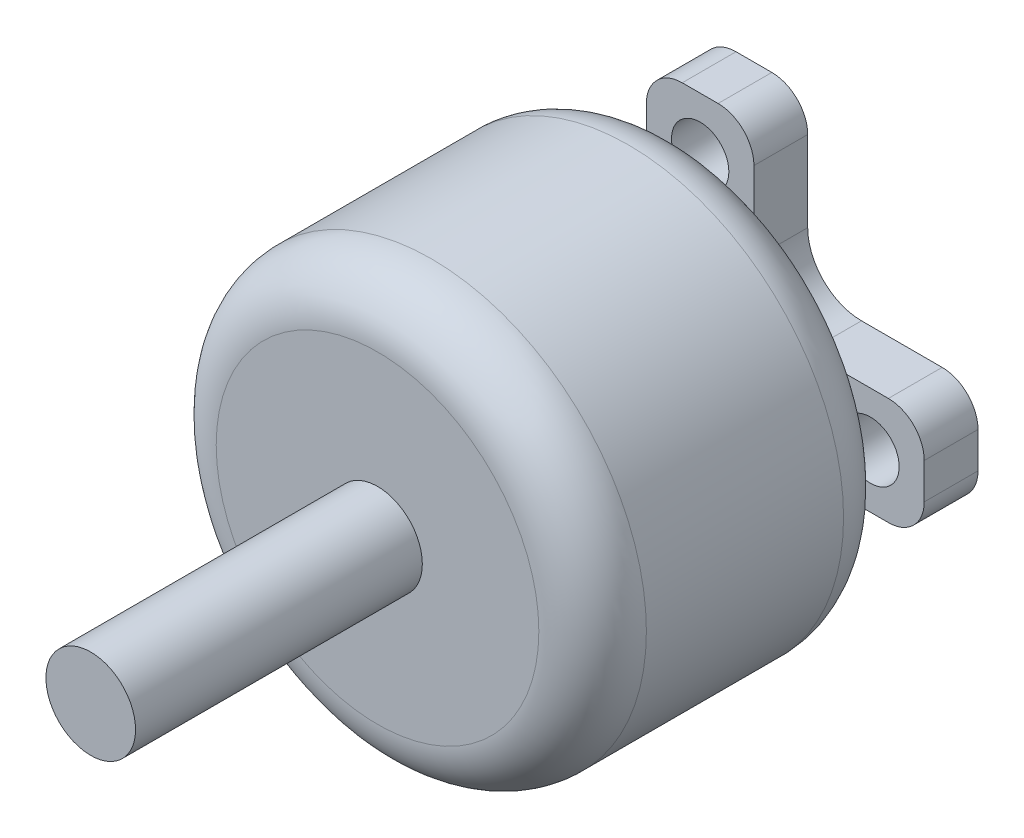
ISO-10303-21;
HEADER;
FILE_DESCRIPTION(('STEP AP214'),'2;1');
FILE_NAME('part.step','',(''),(''),'','','');
FILE_SCHEMA(('AUTOMOTIVE_DESIGN { 1 0 10303 214 1 1 1 1 }'));
ENDSEC;
DATA;
#1=APPLICATION_CONTEXT('core data for automotive mechanical design processes');
#2=APPLICATION_PROTOCOL_DEFINITION('international standard','automotive_design',2000,#1);
#3=PRODUCT_CONTEXT('',#1,'mechanical');
#4=PRODUCT('Part','Part','',(#3));
#5=PRODUCT_RELATED_PRODUCT_CATEGORY('part','',(#4));
#6=PRODUCT_DEFINITION_FORMATION('','',#4);
#7=PRODUCT_DEFINITION_CONTEXT('part definition',#1,'design');
#8=PRODUCT_DEFINITION('design','',#6,#7);
#9=PRODUCT_DEFINITION_SHAPE('','',#8);
#10=(LENGTH_UNIT() NAMED_UNIT(*) SI_UNIT(.MILLI.,.METRE.));
#11=(NAMED_UNIT(*) PLANE_ANGLE_UNIT() SI_UNIT($,.RADIAN.));
#12=(NAMED_UNIT(*) SI_UNIT($,.STERADIAN.) SOLID_ANGLE_UNIT());
#13=UNCERTAINTY_MEASURE_WITH_UNIT(LENGTH_MEASURE(1.E-05),#10,'distance_accuracy_value','');
#14=(GEOMETRIC_REPRESENTATION_CONTEXT(3) GLOBAL_UNCERTAINTY_ASSIGNED_CONTEXT((#13)) GLOBAL_UNIT_ASSIGNED_CONTEXT((#10,
#11,#12)) REPRESENTATION_CONTEXT('',''));
#15=CARTESIAN_POINT('',(0.,0.,0.));
#16=DIRECTION('',(0.,0.,1.));
#17=DIRECTION('',(1.,0.,0.));
#18=AXIS2_PLACEMENT_3D('',#15,#16,#17);
#19=CARTESIAN_POINT('',(-83.7817459305203,-83.7817459305202,3.));
#20=DIRECTION('',(0.,0.,1.));
#21=DIRECTION('',(1.,0.,0.));
#22=AXIS2_PLACEMENT_3D('',#19,#20,#21);
#23=PLANE('',#22);
#24=CARTESIAN_POINT('',(-77.7817459305204,-77.7817459305201,3.));
#25=DIRECTION('',(0.,0.,1.));
#26=DIRECTION('',(1.,0.,0.));
#27=AXIS2_PLACEMENT_3D('',#24,#25,#26);
#28=CIRCLE('',#27,2.85201126427934);
#29=CARTESIAN_POINT('',(-74.9297346662411,-77.7817459305201,3.));
#30=VERTEX_POINT('',#29);
#31=EDGE_CURVE('E373',#30,#30,#28,.T.);
#32=ORIENTED_EDGE('',*,*,#31,.F.);
#33=EDGE_LOOP('',(#32));
#34=FACE_BOUND('',#33,.T.);
#35=CARTESIAN_POINT('',(-77.7817459305203,-87.2817459305201,3.));
#36=DIRECTION('',(0.,0.,1.));
#37=DIRECTION('',(1.,0.,0.));
#38=AXIS2_PLACEMENT_3D('',#35,#36,#37);
#39=CIRCLE('',#38,1.59999999999992);
#40=CARTESIAN_POINT('',(-76.1817459305204,-87.2817459305201,3.));
#41=VERTEX_POINT('',#40);
#42=EDGE_CURVE('E382',#41,#41,#39,.T.);
#43=ORIENTED_EDGE('',*,*,#42,.F.);
#44=EDGE_LOOP('',(#43));
#45=FACE_BOUND('',#44,.T.);
#46=CARTESIAN_POINT('',(-77.7817459305205,-68.2817459305201,3.));
#47=DIRECTION('',(0.,0.,1.));
#48=DIRECTION('',(1.,0.,0.));
#49=AXIS2_PLACEMENT_3D('',#46,#47,#48);
#50=CIRCLE('',#49,1.60000000000002);
#51=CARTESIAN_POINT('',(-76.1817459305204,-68.2817459305201,3.));
#52=VERTEX_POINT('',#51);
#53=EDGE_CURVE('E233',#52,#52,#50,.T.);
#54=ORIENTED_EDGE('',*,*,#53,.F.);
#55=EDGE_LOOP('',(#54));
#56=FACE_BOUND('',#55,.T.);
#57=CARTESIAN_POINT('',(-83.7817459305203,-83.7817459305202,3.));
#58=DIRECTION('',(0.,0.,-1.));
#59=DIRECTION('',(1.,0.,0.));
#60=AXIS2_PLACEMENT_3D('',#57,#58,#59);
#61=CIRCLE('',#60,3.);
#62=CARTESIAN_POINT('',(-83.7817459305203,-80.7817459305202,3.));
#63=VERTEX_POINT('',#62);
#64=CARTESIAN_POINT('',(-80.7817459305203,-83.7817459305202,3.));
#65=VERTEX_POINT('',#64);
#66=EDGE_CURVE('E276',#63,#65,#61,.T.);
#67=ORIENTED_EDGE('',*,*,#66,.T.);
#68=DIRECTION('',(0.,-1.,0.));
#69=VECTOR('',#68,1.);
#70=CARTESIAN_POINT('',(-80.7817459305203,-83.7817459305202,3.));
#71=LINE('',#70,#69);
#72=CARTESIAN_POINT('',(-80.7817459305203,-88.2817459305201,3.));
#73=VERTEX_POINT('',#72);
#74=EDGE_CURVE('E144',#65,#73,#71,.T.);
#75=ORIENTED_EDGE('',*,*,#74,.T.);
#76=CARTESIAN_POINT('',(-78.7817459305203,-88.2817459305201,3.));
#77=DIRECTION('',(0.,0.,1.));
#78=DIRECTION('',(1.,0.,0.));
#79=AXIS2_PLACEMENT_3D('',#76,#77,#78);
#80=CIRCLE('',#79,2.);
#81=CARTESIAN_POINT('',(-78.7817459305203,-90.2817459305201,3.));
#82=VERTEX_POINT('',#81);
#83=EDGE_CURVE('E400',#73,#82,#80,.T.);
#84=ORIENTED_EDGE('',*,*,#83,.T.);
#85=DIRECTION('',(1.,0.,0.));
#86=VECTOR('',#85,1.);
#87=CARTESIAN_POINT('',(-78.7817459305203,-90.2817459305201,3.));
#88=LINE('',#87,#86);
#89=CARTESIAN_POINT('',(-76.7817459305203,-90.2817459305201,3.));
#90=VERTEX_POINT('',#89);
#91=EDGE_CURVE('E402',#82,#90,#88,.T.);
#92=ORIENTED_EDGE('',*,*,#91,.T.);
#93=CARTESIAN_POINT('',(-76.7817459305203,-88.2817459305201,3.));
#94=DIRECTION('',(0.,0.,1.));
#95=DIRECTION('',(1.,0.,0.));
#96=AXIS2_PLACEMENT_3D('',#93,#94,#95);
#97=CIRCLE('',#96,2.);
#98=CARTESIAN_POINT('',(-74.7817459305203,-88.2817459305201,3.));
#99=VERTEX_POINT('',#98);
#100=EDGE_CURVE('E404',#90,#99,#97,.T.);
#101=ORIENTED_EDGE('',*,*,#100,.T.);
#102=DIRECTION('',(0.,1.,0.));
#103=VECTOR('',#102,1.);
#104=CARTESIAN_POINT('',(-74.7817459305203,-83.7817459305202,3.));
#105=LINE('',#104,#103);
#106=CARTESIAN_POINT('',(-74.7817459305203,-83.7817459305202,3.));
#107=VERTEX_POINT('',#106);
#108=EDGE_CURVE('E406',#99,#107,#105,.T.);
#109=ORIENTED_EDGE('',*,*,#108,.T.);
#110=CARTESIAN_POINT('',(-71.7817459305203,-83.7817459305202,3.));
#111=DIRECTION('',(0.,0.,-1.));
#112=DIRECTION('',(-1.,0.,0.));
#113=AXIS2_PLACEMENT_3D('',#110,#111,#112);
#114=CIRCLE('',#113,3.);
#115=CARTESIAN_POINT('',(-71.7817459305203,-80.7817459305202,3.));
#116=VERTEX_POINT('',#115);
#117=EDGE_CURVE('E408',#107,#116,#114,.T.);
#118=ORIENTED_EDGE('',*,*,#117,.T.);
#119=DIRECTION('',(1.,0.,0.));
#120=VECTOR('',#119,1.);
#121=CARTESIAN_POINT('',(-71.7817459305203,-80.7817459305202,3.));
#122=LINE('',#121,#120);
#123=CARTESIAN_POINT('',(-67.2817459305204,-80.7817459305202,3.));
#124=VERTEX_POINT('',#123);
#125=EDGE_CURVE('E410',#116,#124,#122,.T.);
#126=ORIENTED_EDGE('',*,*,#125,.T.);
#127=CARTESIAN_POINT('',(-67.2817459305204,-78.7817459305202,3.));
#128=DIRECTION('',(0.,0.,1.));
#129=DIRECTION('',(1.,0.,0.));
#130=AXIS2_PLACEMENT_3D('',#127,#128,#129);
#131=CIRCLE('',#130,2.);
#132=CARTESIAN_POINT('',(-65.2817459305204,-78.7817459305202,3.));
#133=VERTEX_POINT('',#132);
#134=EDGE_CURVE('E412',#124,#133,#131,.T.);
#135=ORIENTED_EDGE('',*,*,#134,.T.);
#136=DIRECTION('',(0.,1.,0.));
#137=VECTOR('',#136,1.);
#138=CARTESIAN_POINT('',(-65.2817459305204,-76.7817459305202,3.));
#139=LINE('',#138,#137);
#140=CARTESIAN_POINT('',(-65.2817459305204,-76.7817459305202,3.));
#141=VERTEX_POINT('',#140);
#142=EDGE_CURVE('E414',#133,#141,#139,.T.);
#143=ORIENTED_EDGE('',*,*,#142,.T.);
#144=CARTESIAN_POINT('',(-67.2817459305204,-76.7817459305202,3.));
#145=DIRECTION('',(0.,0.,1.));
#146=DIRECTION('',(-1.,0.,0.));
#147=AXIS2_PLACEMENT_3D('',#144,#145,#146);
#148=CIRCLE('',#147,2.);
#149=CARTESIAN_POINT('',(-67.2817459305204,-74.7817459305202,3.));
#150=VERTEX_POINT('',#149);
#151=EDGE_CURVE('E416',#141,#150,#148,.T.);
#152=ORIENTED_EDGE('',*,*,#151,.T.);
#153=DIRECTION('',(-1.,0.,0.));
#154=VECTOR('',#153,1.);
#155=CARTESIAN_POINT('',(-71.7817459305203,-74.7817459305202,3.));
#156=LINE('',#155,#154);
#157=CARTESIAN_POINT('',(-71.7817459305203,-74.7817459305202,3.));
#158=VERTEX_POINT('',#157);
#159=EDGE_CURVE('E418',#150,#158,#156,.T.);
#160=ORIENTED_EDGE('',*,*,#159,.T.);
#161=CARTESIAN_POINT('',(-71.7817459305203,-71.7817459305202,3.));
#162=DIRECTION('',(0.,0.,-1.));
#163=DIRECTION('',(-1.,0.,0.));
#164=AXIS2_PLACEMENT_3D('',#161,#162,#163);
#165=CIRCLE('',#164,3.);
#166=CARTESIAN_POINT('',(-74.7817459305203,-71.7817459305202,3.));
#167=VERTEX_POINT('',#166);
#168=EDGE_CURVE('E420',#158,#167,#165,.T.);
#169=ORIENTED_EDGE('',*,*,#168,.T.);
#170=DIRECTION('',(0.,1.,0.));
#171=VECTOR('',#170,1.);
#172=CARTESIAN_POINT('',(-74.7817459305203,-67.2817459305201,3.));
#173=LINE('',#172,#171);
#174=CARTESIAN_POINT('',(-74.7817459305203,-67.2817459305201,3.));
#175=VERTEX_POINT('',#174);
#176=EDGE_CURVE('E422',#167,#175,#173,.T.);
#177=ORIENTED_EDGE('',*,*,#176,.T.);
#178=CARTESIAN_POINT('',(-76.7817459305203,-67.2817459305201,3.));
#179=DIRECTION('',(0.,0.,1.));
#180=DIRECTION('',(-1.,0.,0.));
#181=AXIS2_PLACEMENT_3D('',#178,#179,#180);
#182=CIRCLE('',#181,2.);
#183=CARTESIAN_POINT('',(-76.7817459305203,-65.2817459305201,3.));
#184=VERTEX_POINT('',#183);
#185=EDGE_CURVE('E424',#175,#184,#182,.T.);
#186=ORIENTED_EDGE('',*,*,#185,.T.);
#187=DIRECTION('',(-1.,0.,0.));
#188=VECTOR('',#187,1.);
#189=CARTESIAN_POINT('',(-78.7817459305203,-65.2817459305201,3.));
#190=LINE('',#189,#188);
#191=CARTESIAN_POINT('',(-78.7817459305203,-65.2817459305201,3.));
#192=VERTEX_POINT('',#191);
#193=EDGE_CURVE('E426',#184,#192,#190,.T.);
#194=ORIENTED_EDGE('',*,*,#193,.T.);
#195=CARTESIAN_POINT('',(-78.7817459305203,-67.2817459305201,3.));
#196=DIRECTION('',(0.,0.,1.));
#197=DIRECTION('',(1.,0.,0.));
#198=AXIS2_PLACEMENT_3D('',#195,#196,#197);
#199=CIRCLE('',#198,2.);
#200=CARTESIAN_POINT('',(-80.7817459305203,-67.2817459305201,3.));
#201=VERTEX_POINT('',#200);
#202=EDGE_CURVE('E428',#192,#201,#199,.T.);
#203=ORIENTED_EDGE('',*,*,#202,.T.);
#204=DIRECTION('',(0.,-1.,0.));
#205=VECTOR('',#204,1.);
#206=CARTESIAN_POINT('',(-80.7817459305203,-67.2817459305201,3.));
#207=LINE('',#206,#205);
#208=CARTESIAN_POINT('',(-80.7817459305203,-71.7817459305202,3.));
#209=VERTEX_POINT('',#208);
#210=EDGE_CURVE('E430',#201,#209,#207,.T.);
#211=ORIENTED_EDGE('',*,*,#210,.T.);
#212=CARTESIAN_POINT('',(-83.7817459305203,-71.7817459305202,3.));
#213=DIRECTION('',(0.,0.,-1.));
#214=DIRECTION('',(1.,0.,0.));
#215=AXIS2_PLACEMENT_3D('',#212,#213,#214);
#216=CIRCLE('',#215,3.);
#217=CARTESIAN_POINT('',(-83.7817459305203,-74.7817459305202,3.));
#218=VERTEX_POINT('',#217);
#219=EDGE_CURVE('E432',#209,#218,#216,.T.);
#220=ORIENTED_EDGE('',*,*,#219,.T.);
#221=DIRECTION('',(-1.,0.,0.));
#222=VECTOR('',#221,1.);
#223=CARTESIAN_POINT('',(-88.2817459305204,-74.7817459305202,3.));
#224=LINE('',#223,#222);
#225=CARTESIAN_POINT('',(-88.2817459305204,-74.7817459305202,3.));
#226=VERTEX_POINT('',#225);
#227=EDGE_CURVE('E434',#218,#226,#224,.T.);
#228=ORIENTED_EDGE('',*,*,#227,.T.);
#229=CARTESIAN_POINT('',(-88.2817459305204,-76.7817459305202,3.));
#230=DIRECTION('',(0.,0.,1.));
#231=DIRECTION('',(1.,0.,0.));
#232=AXIS2_PLACEMENT_3D('',#229,#230,#231);
#233=CIRCLE('',#232,2.);
#234=CARTESIAN_POINT('',(-90.2817459305204,-76.7817459305202,3.));
#235=VERTEX_POINT('',#234);
#236=EDGE_CURVE('E211',#226,#235,#233,.T.);
#237=ORIENTED_EDGE('',*,*,#236,.T.);
#238=DIRECTION('',(0.,-1.,0.));
#239=VECTOR('',#238,1.);
#240=CARTESIAN_POINT('',(-90.2817459305204,-76.7817459305202,3.));
#241=LINE('',#240,#239);
#242=CARTESIAN_POINT('',(-90.2817459305204,-78.7817459305202,3.));
#243=VERTEX_POINT('',#242);
#244=EDGE_CURVE('E205',#235,#243,#241,.T.);
#245=ORIENTED_EDGE('',*,*,#244,.T.);
#246=CARTESIAN_POINT('',(-88.2817459305204,-78.7817459305202,3.));
#247=DIRECTION('',(0.,0.,1.));
#248=DIRECTION('',(1.,0.,0.));
#249=AXIS2_PLACEMENT_3D('',#246,#247,#248);
#250=CIRCLE('',#249,2.);
#251=CARTESIAN_POINT('',(-88.2817459305204,-80.7817459305202,3.));
#252=VERTEX_POINT('',#251);
#253=EDGE_CURVE('E209',#243,#252,#250,.T.);
#254=ORIENTED_EDGE('',*,*,#253,.T.);
#255=DIRECTION('',(1.,0.,0.));
#256=VECTOR('',#255,1.);
#257=CARTESIAN_POINT('',(-88.2817459305204,-80.7817459305202,3.));
#258=LINE('',#257,#256);
#259=EDGE_CURVE('E52',#252,#63,#258,.T.);
#260=ORIENTED_EDGE('',*,*,#259,.T.);
#261=EDGE_LOOP('',(#67,#75,#84,#92,#101,#109,#118,#126,#135,#143,#152,#160,#169,#177,#186,#194,
#203,#211,#220,#228,#237,#245,#254,#260));
#262=FACE_BOUND('',#261,.T.);
#263=CARTESIAN_POINT('',(-68.2817459305204,-77.7817459305201,3.));
#264=DIRECTION('',(0.,0.,1.));
#265=DIRECTION('',(1.,0.,0.));
#266=AXIS2_PLACEMENT_3D('',#263,#264,#265);
#267=CIRCLE('',#266,1.59999999999995);
#268=CARTESIAN_POINT('',(-66.6817459305205,-77.7817459305201,3.));
#269=VERTEX_POINT('',#268);
#270=EDGE_CURVE('E388',#269,#269,#267,.T.);
#271=ORIENTED_EDGE('',*,*,#270,.F.);
#272=EDGE_LOOP('',(#271));
#273=FACE_BOUND('',#272,.T.);
#274=CARTESIAN_POINT('',(-87.2817459305204,-77.7817459305202,3.));
#275=DIRECTION('',(0.,0.,1.));
#276=DIRECTION('',(1.,0.,0.));
#277=AXIS2_PLACEMENT_3D('',#274,#275,#276);
#278=CIRCLE('',#277,1.60000000000001);
#279=CARTESIAN_POINT('',(-85.6817459305204,-77.7817459305202,3.));
#280=VERTEX_POINT('',#279);
#281=EDGE_CURVE('E376',#280,#280,#278,.T.);
#282=ORIENTED_EDGE('',*,*,#281,.F.);
#283=EDGE_LOOP('',(#282));
#284=FACE_BOUND('',#283,.T.);
#285=ADVANCED_FACE('F35',(#34,#45,#56,#262,#273,#284),#23,.T.);
#286=CARTESIAN_POINT('',(-83.7817459305203,-83.7817459305202,0.));
#287=DIRECTION('',(0.,0.,1.));
#288=DIRECTION('',(1.,0.,0.));
#289=AXIS2_PLACEMENT_3D('',#286,#287,#288);
#290=PLANE('',#289);
#291=CARTESIAN_POINT('',(-83.7817459305203,-83.7817459305202,0.));
#292=DIRECTION('',(0.,0.,-1.));
#293=DIRECTION('',(1.,0.,0.));
#294=AXIS2_PLACEMENT_3D('',#291,#292,#293);
#295=CIRCLE('',#294,3.);
#296=CARTESIAN_POINT('',(-83.7817459305203,-80.7817459305202,0.));
#297=VERTEX_POINT('',#296);
#298=CARTESIAN_POINT('',(-80.7817459305203,-83.7817459305202,0.));
#299=VERTEX_POINT('',#298);
#300=EDGE_CURVE('E229',#297,#299,#295,.T.);
#301=ORIENTED_EDGE('',*,*,#300,.F.);
#302=DIRECTION('',(1.,0.,0.));
#303=VECTOR('',#302,1.);
#304=CARTESIAN_POINT('',(-88.2817459305204,-80.7817459305202,0.));
#305=LINE('',#304,#303);
#306=CARTESIAN_POINT('',(-88.2817459305204,-80.7817459305202,0.));
#307=VERTEX_POINT('',#306);
#308=EDGE_CURVE('E135',#307,#297,#305,.T.);
#309=ORIENTED_EDGE('',*,*,#308,.F.);
#310=CARTESIAN_POINT('',(-88.2817459305204,-78.7817459305202,0.));
#311=DIRECTION('',(0.,0.,1.));
#312=DIRECTION('',(1.,0.,0.));
#313=AXIS2_PLACEMENT_3D('',#310,#311,#312);
#314=CIRCLE('',#313,2.);
#315=CARTESIAN_POINT('',(-90.2817459305204,-78.7817459305202,0.));
#316=VERTEX_POINT('',#315);
#317=EDGE_CURVE('E129',#316,#307,#314,.T.);
#318=ORIENTED_EDGE('',*,*,#317,.F.);
#319=DIRECTION('',(0.,-1.,0.));
#320=VECTOR('',#319,1.);
#321=CARTESIAN_POINT('',(-90.2817459305204,-76.7817459305202,0.));
#322=LINE('',#321,#320);
#323=CARTESIAN_POINT('',(-90.2817459305204,-76.7817459305202,0.));
#324=VERTEX_POINT('',#323);
#325=EDGE_CURVE('E219',#324,#316,#322,.T.);
#326=ORIENTED_EDGE('',*,*,#325,.F.);
#327=CARTESIAN_POINT('',(-88.2817459305204,-76.7817459305202,0.));
#328=DIRECTION('',(0.,0.,1.));
#329=DIRECTION('',(1.,0.,0.));
#330=AXIS2_PLACEMENT_3D('',#327,#328,#329);
#331=CIRCLE('',#330,2.);
#332=CARTESIAN_POINT('',(-88.2817459305204,-74.7817459305202,0.));
#333=VERTEX_POINT('',#332);
#334=EDGE_CURVE('E271',#333,#324,#331,.T.);
#335=ORIENTED_EDGE('',*,*,#334,.F.);
#336=DIRECTION('',(-1.,0.,0.));
#337=VECTOR('',#336,1.);
#338=CARTESIAN_POINT('',(-88.2817459305204,-74.7817459305202,0.));
#339=LINE('',#338,#337);
#340=CARTESIAN_POINT('',(-83.7817459305203,-74.7817459305202,0.));
#341=VERTEX_POINT('',#340);
#342=EDGE_CURVE('E269',#341,#333,#339,.T.);
#343=ORIENTED_EDGE('',*,*,#342,.F.);
#344=CARTESIAN_POINT('',(-83.7817459305203,-71.7817459305202,0.));
#345=DIRECTION('',(0.,0.,-1.));
#346=DIRECTION('',(1.,0.,0.));
#347=AXIS2_PLACEMENT_3D('',#344,#345,#346);
#348=CIRCLE('',#347,3.);
#349=CARTESIAN_POINT('',(-80.7817459305203,-71.7817459305202,0.));
#350=VERTEX_POINT('',#349);
#351=EDGE_CURVE('E267',#350,#341,#348,.T.);
#352=ORIENTED_EDGE('',*,*,#351,.F.);
#353=DIRECTION('',(0.,-1.,0.));
#354=VECTOR('',#353,1.);
#355=CARTESIAN_POINT('',(-80.7817459305203,-67.2817459305201,0.));
#356=LINE('',#355,#354);
#357=CARTESIAN_POINT('',(-80.7817459305203,-67.2817459305201,0.));
#358=VERTEX_POINT('',#357);
#359=EDGE_CURVE('E265',#358,#350,#356,.T.);
#360=ORIENTED_EDGE('',*,*,#359,.F.);
#361=CARTESIAN_POINT('',(-78.7817459305203,-67.2817459305201,0.));
#362=DIRECTION('',(0.,0.,1.));
#363=DIRECTION('',(1.,0.,0.));
#364=AXIS2_PLACEMENT_3D('',#361,#362,#363);
#365=CIRCLE('',#364,2.);
#366=CARTESIAN_POINT('',(-78.7817459305203,-65.2817459305201,0.));
#367=VERTEX_POINT('',#366);
#368=EDGE_CURVE('E263',#367,#358,#365,.T.);
#369=ORIENTED_EDGE('',*,*,#368,.F.);
#370=DIRECTION('',(-1.,0.,0.));
#371=VECTOR('',#370,1.);
#372=CARTESIAN_POINT('',(-78.7817459305203,-65.2817459305201,0.));
#373=LINE('',#372,#371);
#374=CARTESIAN_POINT('',(-76.7817459305203,-65.2817459305201,0.));
#375=VERTEX_POINT('',#374);
#376=EDGE_CURVE('E261',#375,#367,#373,.T.);
#377=ORIENTED_EDGE('',*,*,#376,.F.);
#378=CARTESIAN_POINT('',(-76.7817459305203,-67.2817459305201,0.));
#379=DIRECTION('',(0.,0.,1.));
#380=DIRECTION('',(-1.,0.,0.));
#381=AXIS2_PLACEMENT_3D('',#378,#379,#380);
#382=CIRCLE('',#381,2.);
#383=CARTESIAN_POINT('',(-74.7817459305203,-67.2817459305201,0.));
#384=VERTEX_POINT('',#383);
#385=EDGE_CURVE('E259',#384,#375,#382,.T.);
#386=ORIENTED_EDGE('',*,*,#385,.F.);
#387=DIRECTION('',(0.,1.,0.));
#388=VECTOR('',#387,1.);
#389=CARTESIAN_POINT('',(-74.7817459305203,-67.2817459305201,0.));
#390=LINE('',#389,#388);
#391=CARTESIAN_POINT('',(-74.7817459305203,-71.7817459305202,0.));
#392=VERTEX_POINT('',#391);
#393=EDGE_CURVE('E257',#392,#384,#390,.T.);
#394=ORIENTED_EDGE('',*,*,#393,.F.);
#395=CARTESIAN_POINT('',(-71.7817459305203,-71.7817459305202,0.));
#396=DIRECTION('',(0.,0.,-1.));
#397=DIRECTION('',(-1.,0.,0.));
#398=AXIS2_PLACEMENT_3D('',#395,#396,#397);
#399=CIRCLE('',#398,3.);
#400=CARTESIAN_POINT('',(-71.7817459305203,-74.7817459305202,0.));
#401=VERTEX_POINT('',#400);
#402=EDGE_CURVE('E255',#401,#392,#399,.T.);
#403=ORIENTED_EDGE('',*,*,#402,.F.);
#404=DIRECTION('',(-1.,0.,0.));
#405=VECTOR('',#404,1.);
#406=CARTESIAN_POINT('',(-71.7817459305203,-74.7817459305202,0.));
#407=LINE('',#406,#405);
#408=CARTESIAN_POINT('',(-67.2817459305204,-74.7817459305202,0.));
#409=VERTEX_POINT('',#408);
#410=EDGE_CURVE('E253',#409,#401,#407,.T.);
#411=ORIENTED_EDGE('',*,*,#410,.F.);
#412=CARTESIAN_POINT('',(-67.2817459305204,-76.7817459305202,0.));
#413=DIRECTION('',(0.,0.,1.));
#414=DIRECTION('',(-1.,0.,0.));
#415=AXIS2_PLACEMENT_3D('',#412,#413,#414);
#416=CIRCLE('',#415,2.);
#417=CARTESIAN_POINT('',(-65.2817459305204,-76.7817459305202,0.));
#418=VERTEX_POINT('',#417);
#419=EDGE_CURVE('E251',#418,#409,#416,.T.);
#420=ORIENTED_EDGE('',*,*,#419,.F.);
#421=DIRECTION('',(0.,1.,0.));
#422=VECTOR('',#421,1.);
#423=CARTESIAN_POINT('',(-65.2817459305204,-76.7817459305202,0.));
#424=LINE('',#423,#422);
#425=CARTESIAN_POINT('',(-65.2817459305204,-78.7817459305202,0.));
#426=VERTEX_POINT('',#425);
#427=EDGE_CURVE('E249',#426,#418,#424,.T.);
#428=ORIENTED_EDGE('',*,*,#427,.F.);
#429=CARTESIAN_POINT('',(-67.2817459305204,-78.7817459305202,0.));
#430=DIRECTION('',(0.,0.,1.));
#431=DIRECTION('',(1.,0.,0.));
#432=AXIS2_PLACEMENT_3D('',#429,#430,#431);
#433=CIRCLE('',#432,2.);
#434=CARTESIAN_POINT('',(-67.2817459305204,-80.7817459305202,0.));
#435=VERTEX_POINT('',#434);
#436=EDGE_CURVE('E247',#435,#426,#433,.T.);
#437=ORIENTED_EDGE('',*,*,#436,.F.);
#438=DIRECTION('',(1.,0.,0.));
#439=VECTOR('',#438,1.);
#440=CARTESIAN_POINT('',(-71.7817459305203,-80.7817459305202,0.));
#441=LINE('',#440,#439);
#442=CARTESIAN_POINT('',(-71.7817459305203,-80.7817459305202,0.));
#443=VERTEX_POINT('',#442);
#444=EDGE_CURVE('E245',#443,#435,#441,.T.);
#445=ORIENTED_EDGE('',*,*,#444,.F.);
#446=CARTESIAN_POINT('',(-71.7817459305203,-83.7817459305202,0.));
#447=DIRECTION('',(0.,0.,-1.));
#448=DIRECTION('',(-1.,0.,0.));
#449=AXIS2_PLACEMENT_3D('',#446,#447,#448);
#450=CIRCLE('',#449,3.);
#451=CARTESIAN_POINT('',(-74.7817459305203,-83.7817459305202,0.));
#452=VERTEX_POINT('',#451);
#453=EDGE_CURVE('E243',#452,#443,#450,.T.);
#454=ORIENTED_EDGE('',*,*,#453,.F.);
#455=DIRECTION('',(0.,1.,0.));
#456=VECTOR('',#455,1.);
#457=CARTESIAN_POINT('',(-74.7817459305203,-83.7817459305202,0.));
#458=LINE('',#457,#456);
#459=CARTESIAN_POINT('',(-74.7817459305203,-88.2817459305201,0.));
#460=VERTEX_POINT('',#459);
#461=EDGE_CURVE('E241',#460,#452,#458,.T.);
#462=ORIENTED_EDGE('',*,*,#461,.F.);
#463=CARTESIAN_POINT('',(-76.7817459305203,-88.2817459305201,0.));
#464=DIRECTION('',(0.,0.,1.));
#465=DIRECTION('',(1.,0.,0.));
#466=AXIS2_PLACEMENT_3D('',#463,#464,#465);
#467=CIRCLE('',#466,2.);
#468=CARTESIAN_POINT('',(-76.7817459305203,-90.2817459305201,0.));
#469=VERTEX_POINT('',#468);
#470=EDGE_CURVE('E239',#469,#460,#467,.T.);
#471=ORIENTED_EDGE('',*,*,#470,.F.);
#472=DIRECTION('',(1.,0.,0.));
#473=VECTOR('',#472,1.);
#474=CARTESIAN_POINT('',(-78.7817459305203,-90.2817459305201,0.));
#475=LINE('',#474,#473);
#476=CARTESIAN_POINT('',(-78.7817459305203,-90.2817459305201,0.));
#477=VERTEX_POINT('',#476);
#478=EDGE_CURVE('E237',#477,#469,#475,.T.);
#479=ORIENTED_EDGE('',*,*,#478,.F.);
#480=CARTESIAN_POINT('',(-78.7817459305203,-88.2817459305201,0.));
#481=DIRECTION('',(0.,0.,1.));
#482=DIRECTION('',(1.,0.,0.));
#483=AXIS2_PLACEMENT_3D('',#480,#481,#482);
#484=CIRCLE('',#483,2.);
#485=CARTESIAN_POINT('',(-80.7817459305203,-88.2817459305201,0.));
#486=VERTEX_POINT('',#485);
#487=EDGE_CURVE('E235',#486,#477,#484,.T.);
#488=ORIENTED_EDGE('',*,*,#487,.F.);
#489=DIRECTION('',(0.,-1.,0.));
#490=VECTOR('',#489,1.);
#491=CARTESIAN_POINT('',(-80.7817459305203,-83.7817459305202,0.));
#492=LINE('',#491,#490);
#493=EDGE_CURVE('E232',#299,#486,#492,.T.);
#494=ORIENTED_EDGE('',*,*,#493,.F.);
#495=EDGE_LOOP('',(#301,#309,#318,#326,#335,#343,#352,#360,#369,#377,#386,#394,#403,#411,#420,
#428,#437,#445,#454,#462,#471,#479,#488,#494));
#496=FACE_BOUND('',#495,.T.);
#497=CARTESIAN_POINT('',(-77.7817459305205,-68.2817459305201,0.));
#498=DIRECTION('',(0.,0.,1.));
#499=DIRECTION('',(1.,0.,0.));
#500=AXIS2_PLACEMENT_3D('',#497,#498,#499);
#501=CIRCLE('',#500,1.60000000000002);
#502=CARTESIAN_POINT('',(-76.1817459305204,-68.2817459305201,0.));
#503=VERTEX_POINT('',#502);
#504=EDGE_CURVE('E391',#503,#503,#501,.T.);
#505=ORIENTED_EDGE('',*,*,#504,.T.);
#506=EDGE_LOOP('',(#505));
#507=FACE_BOUND('',#506,.T.);
#508=CARTESIAN_POINT('',(-68.2817459305204,-77.7817459305201,0.));
#509=DIRECTION('',(0.,0.,1.));
#510=DIRECTION('',(1.,0.,0.));
#511=AXIS2_PLACEMENT_3D('',#508,#509,#510);
#512=CIRCLE('',#511,1.59999999999995);
#513=CARTESIAN_POINT('',(-66.6817459305205,-77.7817459305201,0.));
#514=VERTEX_POINT('',#513);
#515=EDGE_CURVE('E385',#514,#514,#512,.T.);
#516=ORIENTED_EDGE('',*,*,#515,.T.);
#517=EDGE_LOOP('',(#516));
#518=FACE_BOUND('',#517,.T.);
#519=CARTESIAN_POINT('',(-77.7817459305203,-87.2817459305201,0.));
#520=DIRECTION('',(0.,0.,1.));
#521=DIRECTION('',(1.,0.,0.));
#522=AXIS2_PLACEMENT_3D('',#519,#520,#521);
#523=CIRCLE('',#522,1.59999999999992);
#524=CARTESIAN_POINT('',(-76.1817459305204,-87.2817459305201,0.));
#525=VERTEX_POINT('',#524);
#526=EDGE_CURVE('E379',#525,#525,#523,.T.);
#527=ORIENTED_EDGE('',*,*,#526,.T.);
#528=EDGE_LOOP('',(#527));
#529=FACE_BOUND('',#528,.T.);
#530=CARTESIAN_POINT('',(-87.2817459305204,-77.7817459305202,0.));
#531=DIRECTION('',(0.,0.,1.));
#532=DIRECTION('',(1.,0.,0.));
#533=AXIS2_PLACEMENT_3D('',#530,#531,#532);
#534=CIRCLE('',#533,1.60000000000001);
#535=CARTESIAN_POINT('',(-85.6817459305204,-77.7817459305202,0.));
#536=VERTEX_POINT('',#535);
#537=EDGE_CURVE('E372',#536,#536,#534,.T.);
#538=ORIENTED_EDGE('',*,*,#537,.T.);
#539=EDGE_LOOP('',(#538));
#540=FACE_BOUND('',#539,.T.);
#541=ADVANCED_FACE('F447',(#496,#507,#518,#529,#540),#290,.F.);
#542=CARTESIAN_POINT('',(-83.7817459305203,-83.7817459305202,3.));
#543=DIRECTION('',(0.,0.,-1.));
#544=DIRECTION('',(-1.,0.,0.));
#545=AXIS2_PLACEMENT_3D('',#542,#543,#544);
#546=CYLINDRICAL_SURFACE('',#545,3.);
#547=ORIENTED_EDGE('',*,*,#300,.T.);
#548=DIRECTION('',(0.,0.,-1.));
#549=VECTOR('',#548,1.);
#550=CARTESIAN_POINT('',(-80.7817459305203,-83.7817459305202,3.));
#551=LINE('',#550,#549);
#552=EDGE_CURVE('E337',#65,#299,#551,.T.);
#553=ORIENTED_EDGE('',*,*,#552,.F.);
#554=ORIENTED_EDGE('',*,*,#66,.F.);
#555=DIRECTION('',(0.,0.,-1.));
#556=VECTOR('',#555,1.);
#557=CARTESIAN_POINT('',(-83.7817459305203,-80.7817459305202,3.));
#558=LINE('',#557,#556);
#559=EDGE_CURVE('E225',#63,#297,#558,.T.);
#560=ORIENTED_EDGE('',*,*,#559,.T.);
#561=EDGE_LOOP('',(#547,#553,#554,#560));
#562=FACE_BOUND('',#561,.T.);
#563=ADVANCED_FACE('F452',(#562),#546,.F.);
#564=CARTESIAN_POINT('',(-80.7817459305203,-83.7817459305202,3.));
#565=DIRECTION('',(1.,0.,0.));
#566=DIRECTION('',(0.,0.,-1.));
#567=AXIS2_PLACEMENT_3D('',#564,#565,#566);
#568=PLANE('',#567);
#569=ORIENTED_EDGE('',*,*,#493,.T.);
#570=DIRECTION('',(0.,0.,-1.));
#571=VECTOR('',#570,1.);
#572=CARTESIAN_POINT('',(-80.7817459305203,-88.2817459305201,3.));
#573=LINE('',#572,#571);
#574=EDGE_CURVE('E334',#73,#486,#573,.T.);
#575=ORIENTED_EDGE('',*,*,#574,.F.);
#576=ORIENTED_EDGE('',*,*,#74,.F.);
#577=ORIENTED_EDGE('',*,*,#552,.T.);
#578=EDGE_LOOP('',(#569,#575,#576,#577));
#579=FACE_BOUND('',#578,.T.);
#580=ADVANCED_FACE('F751',(#579),#568,.F.);
#581=CARTESIAN_POINT('',(-78.7817459305203,-88.2817459305201,3.));
#582=DIRECTION('',(0.,0.,-1.));
#583=DIRECTION('',(-1.,0.,0.));
#584=AXIS2_PLACEMENT_3D('',#581,#582,#583);
#585=CYLINDRICAL_SURFACE('',#584,2.);
#586=ORIENTED_EDGE('',*,*,#487,.T.);
#587=DIRECTION('',(0.,0.,-1.));
#588=VECTOR('',#587,1.);
#589=CARTESIAN_POINT('',(-78.7817459305203,-90.2817459305201,3.));
#590=LINE('',#589,#588);
#591=EDGE_CURVE('E331',#82,#477,#590,.T.);
#592=ORIENTED_EDGE('',*,*,#591,.F.);
#593=ORIENTED_EDGE('',*,*,#83,.F.);
#594=ORIENTED_EDGE('',*,*,#574,.T.);
#595=EDGE_LOOP('',(#586,#592,#593,#594));
#596=FACE_BOUND('',#595,.T.);
#597=ADVANCED_FACE('F742',(#596),#585,.T.);
#598=CARTESIAN_POINT('',(-78.7817459305203,-90.2817459305201,3.));
#599=DIRECTION('',(0.,1.,0.));
#600=DIRECTION('',(0.,0.,1.));
#601=AXIS2_PLACEMENT_3D('',#598,#599,#600);
#602=PLANE('',#601);
#603=ORIENTED_EDGE('',*,*,#478,.T.);
#604=DIRECTION('',(0.,0.,-1.));
#605=VECTOR('',#604,1.);
#606=CARTESIAN_POINT('',(-76.7817459305203,-90.2817459305201,3.));
#607=LINE('',#606,#605);
#608=EDGE_CURVE('E328',#90,#469,#607,.T.);
#609=ORIENTED_EDGE('',*,*,#608,.F.);
#610=ORIENTED_EDGE('',*,*,#91,.F.);
#611=ORIENTED_EDGE('',*,*,#591,.T.);
#612=EDGE_LOOP('',(#603,#609,#610,#611));
#613=FACE_BOUND('',#612,.T.);
#614=ADVANCED_FACE('F733',(#613),#602,.F.);
#615=CARTESIAN_POINT('',(-76.7817459305203,-88.2817459305201,3.));
#616=DIRECTION('',(0.,0.,-1.));
#617=DIRECTION('',(-1.,0.,0.));
#618=AXIS2_PLACEMENT_3D('',#615,#616,#617);
#619=CYLINDRICAL_SURFACE('',#618,2.);
#620=ORIENTED_EDGE('',*,*,#470,.T.);
#621=DIRECTION('',(0.,0.,-1.));
#622=VECTOR('',#621,1.);
#623=CARTESIAN_POINT('',(-74.7817459305203,-88.2817459305201,3.));
#624=LINE('',#623,#622);
#625=EDGE_CURVE('E325',#99,#460,#624,.T.);
#626=ORIENTED_EDGE('',*,*,#625,.F.);
#627=ORIENTED_EDGE('',*,*,#100,.F.);
#628=ORIENTED_EDGE('',*,*,#608,.T.);
#629=EDGE_LOOP('',(#620,#626,#627,#628));
#630=FACE_BOUND('',#629,.T.);
#631=ADVANCED_FACE('F724',(#630),#619,.T.);
#632=CARTESIAN_POINT('',(-74.7817459305203,-83.7817459305202,3.));
#633=DIRECTION('',(-1.,0.,0.));
#634=DIRECTION('',(0.,0.,1.));
#635=AXIS2_PLACEMENT_3D('',#632,#633,#634);
#636=PLANE('',#635);
#637=ORIENTED_EDGE('',*,*,#461,.T.);
#638=DIRECTION('',(0.,0.,-1.));
#639=VECTOR('',#638,1.);
#640=CARTESIAN_POINT('',(-74.7817459305203,-83.7817459305202,3.));
#641=LINE('',#640,#639);
#642=EDGE_CURVE('E322',#107,#452,#641,.T.);
#643=ORIENTED_EDGE('',*,*,#642,.F.);
#644=ORIENTED_EDGE('',*,*,#108,.F.);
#645=ORIENTED_EDGE('',*,*,#625,.T.);
#646=EDGE_LOOP('',(#637,#643,#644,#645));
#647=FACE_BOUND('',#646,.T.);
#648=ADVANCED_FACE('F715',(#647),#636,.F.);
#649=CARTESIAN_POINT('',(-71.7817459305203,-83.7817459305202,3.));
#650=DIRECTION('',(0.,0.,-1.));
#651=DIRECTION('',(-1.,0.,0.));
#652=AXIS2_PLACEMENT_3D('',#649,#650,#651);
#653=CYLINDRICAL_SURFACE('',#652,3.);
#654=ORIENTED_EDGE('',*,*,#453,.T.);
#655=DIRECTION('',(0.,0.,-1.));
#656=VECTOR('',#655,1.);
#657=CARTESIAN_POINT('',(-71.7817459305203,-80.7817459305202,3.));
#658=LINE('',#657,#656);
#659=EDGE_CURVE('E319',#116,#443,#658,.T.);
#660=ORIENTED_EDGE('',*,*,#659,.F.);
#661=ORIENTED_EDGE('',*,*,#117,.F.);
#662=ORIENTED_EDGE('',*,*,#642,.T.);
#663=EDGE_LOOP('',(#654,#660,#661,#662));
#664=FACE_BOUND('',#663,.T.);
#665=ADVANCED_FACE('F706',(#664),#653,.F.);
#666=CARTESIAN_POINT('',(-71.7817459305203,-80.7817459305202,3.));
#667=DIRECTION('',(0.,1.,0.));
#668=DIRECTION('',(0.,0.,1.));
#669=AXIS2_PLACEMENT_3D('',#666,#667,#668);
#670=PLANE('',#669);
#671=ORIENTED_EDGE('',*,*,#444,.T.);
#672=DIRECTION('',(0.,0.,-1.));
#673=VECTOR('',#672,1.);
#674=CARTESIAN_POINT('',(-67.2817459305204,-80.7817459305202,3.));
#675=LINE('',#674,#673);
#676=EDGE_CURVE('E316',#124,#435,#675,.T.);
#677=ORIENTED_EDGE('',*,*,#676,.F.);
#678=ORIENTED_EDGE('',*,*,#125,.F.);
#679=ORIENTED_EDGE('',*,*,#659,.T.);
#680=EDGE_LOOP('',(#671,#677,#678,#679));
#681=FACE_BOUND('',#680,.T.);
#682=ADVANCED_FACE('F697',(#681),#670,.F.);
#683=CARTESIAN_POINT('',(-67.2817459305204,-78.7817459305202,3.));
#684=DIRECTION('',(0.,0.,-1.));
#685=DIRECTION('',(-1.,0.,0.));
#686=AXIS2_PLACEMENT_3D('',#683,#684,#685);
#687=CYLINDRICAL_SURFACE('',#686,2.);
#688=ORIENTED_EDGE('',*,*,#436,.T.);
#689=DIRECTION('',(0.,0.,-1.));
#690=VECTOR('',#689,1.);
#691=CARTESIAN_POINT('',(-65.2817459305204,-78.7817459305202,3.));
#692=LINE('',#691,#690);
#693=EDGE_CURVE('E313',#133,#426,#692,.T.);
#694=ORIENTED_EDGE('',*,*,#693,.F.);
#695=ORIENTED_EDGE('',*,*,#134,.F.);
#696=ORIENTED_EDGE('',*,*,#676,.T.);
#697=EDGE_LOOP('',(#688,#694,#695,#696));
#698=FACE_BOUND('',#697,.T.);
#699=ADVANCED_FACE('F688',(#698),#687,.T.);
#700=CARTESIAN_POINT('',(-65.2817459305204,-76.7817459305202,3.));
#701=DIRECTION('',(-1.,0.,0.));
#702=DIRECTION('',(0.,0.,1.));
#703=AXIS2_PLACEMENT_3D('',#700,#701,#702);
#704=PLANE('',#703);
#705=ORIENTED_EDGE('',*,*,#427,.T.);
#706=DIRECTION('',(0.,0.,-1.));
#707=VECTOR('',#706,1.);
#708=CARTESIAN_POINT('',(-65.2817459305204,-76.7817459305202,3.));
#709=LINE('',#708,#707);
#710=EDGE_CURVE('E310',#141,#418,#709,.T.);
#711=ORIENTED_EDGE('',*,*,#710,.F.);
#712=ORIENTED_EDGE('',*,*,#142,.F.);
#713=ORIENTED_EDGE('',*,*,#693,.T.);
#714=EDGE_LOOP('',(#705,#711,#712,#713));
#715=FACE_BOUND('',#714,.T.);
#716=ADVANCED_FACE('F679',(#715),#704,.F.);
#717=CARTESIAN_POINT('',(-67.2817459305204,-76.7817459305202,3.));
#718=DIRECTION('',(0.,0.,-1.));
#719=DIRECTION('',(-1.,0.,0.));
#720=AXIS2_PLACEMENT_3D('',#717,#718,#719);
#721=CYLINDRICAL_SURFACE('',#720,2.);
#722=ORIENTED_EDGE('',*,*,#419,.T.);
#723=DIRECTION('',(0.,0.,-1.));
#724=VECTOR('',#723,1.);
#725=CARTESIAN_POINT('',(-67.2817459305204,-74.7817459305202,3.));
#726=LINE('',#725,#724);
#727=EDGE_CURVE('E307',#150,#409,#726,.T.);
#728=ORIENTED_EDGE('',*,*,#727,.F.);
#729=ORIENTED_EDGE('',*,*,#151,.F.);
#730=ORIENTED_EDGE('',*,*,#710,.T.);
#731=EDGE_LOOP('',(#722,#728,#729,#730));
#732=FACE_BOUND('',#731,.T.);
#733=ADVANCED_FACE('F670',(#732),#721,.T.);
#734=CARTESIAN_POINT('',(-71.7817459305203,-74.7817459305202,3.));
#735=DIRECTION('',(0.,-1.,0.));
#736=DIRECTION('',(0.,0.,-1.));
#737=AXIS2_PLACEMENT_3D('',#734,#735,#736);
#738=PLANE('',#737);
#739=ORIENTED_EDGE('',*,*,#410,.T.);
#740=DIRECTION('',(0.,0.,-1.));
#741=VECTOR('',#740,1.);
#742=CARTESIAN_POINT('',(-71.7817459305203,-74.7817459305202,3.));
#743=LINE('',#742,#741);
#744=EDGE_CURVE('E304',#158,#401,#743,.T.);
#745=ORIENTED_EDGE('',*,*,#744,.F.);
#746=ORIENTED_EDGE('',*,*,#159,.F.);
#747=ORIENTED_EDGE('',*,*,#727,.T.);
#748=EDGE_LOOP('',(#739,#745,#746,#747));
#749=FACE_BOUND('',#748,.T.);
#750=ADVANCED_FACE('F661',(#749),#738,.F.);
#751=CARTESIAN_POINT('',(-71.7817459305203,-71.7817459305202,3.));
#752=DIRECTION('',(0.,0.,-1.));
#753=DIRECTION('',(-1.,0.,0.));
#754=AXIS2_PLACEMENT_3D('',#751,#752,#753);
#755=CYLINDRICAL_SURFACE('',#754,3.);
#756=ORIENTED_EDGE('',*,*,#402,.T.);
#757=DIRECTION('',(0.,0.,-1.));
#758=VECTOR('',#757,1.);
#759=CARTESIAN_POINT('',(-74.7817459305203,-71.7817459305202,3.));
#760=LINE('',#759,#758);
#761=EDGE_CURVE('E301',#167,#392,#760,.T.);
#762=ORIENTED_EDGE('',*,*,#761,.F.);
#763=ORIENTED_EDGE('',*,*,#168,.F.);
#764=ORIENTED_EDGE('',*,*,#744,.T.);
#765=EDGE_LOOP('',(#756,#762,#763,#764));
#766=FACE_BOUND('',#765,.T.);
#767=ADVANCED_FACE('F652',(#766),#755,.F.);
#768=CARTESIAN_POINT('',(-74.7817459305203,-67.2817459305201,3.));
#769=DIRECTION('',(-1.,0.,0.));
#770=DIRECTION('',(0.,0.,1.));
#771=AXIS2_PLACEMENT_3D('',#768,#769,#770);
#772=PLANE('',#771);
#773=ORIENTED_EDGE('',*,*,#393,.T.);
#774=DIRECTION('',(0.,0.,-1.));
#775=VECTOR('',#774,1.);
#776=CARTESIAN_POINT('',(-74.7817459305203,-67.2817459305201,3.));
#777=LINE('',#776,#775);
#778=EDGE_CURVE('E298',#175,#384,#777,.T.);
#779=ORIENTED_EDGE('',*,*,#778,.F.);
#780=ORIENTED_EDGE('',*,*,#176,.F.);
#781=ORIENTED_EDGE('',*,*,#761,.T.);
#782=EDGE_LOOP('',(#773,#779,#780,#781));
#783=FACE_BOUND('',#782,.T.);
#784=ADVANCED_FACE('F643',(#783),#772,.F.);
#785=CARTESIAN_POINT('',(-76.7817459305203,-67.2817459305201,3.));
#786=DIRECTION('',(0.,0.,-1.));
#787=DIRECTION('',(-1.,0.,0.));
#788=AXIS2_PLACEMENT_3D('',#785,#786,#787);
#789=CYLINDRICAL_SURFACE('',#788,2.);
#790=ORIENTED_EDGE('',*,*,#385,.T.);
#791=DIRECTION('',(0.,0.,-1.));
#792=VECTOR('',#791,1.);
#793=CARTESIAN_POINT('',(-76.7817459305203,-65.2817459305201,3.));
#794=LINE('',#793,#792);
#795=EDGE_CURVE('E295',#184,#375,#794,.T.);
#796=ORIENTED_EDGE('',*,*,#795,.F.);
#797=ORIENTED_EDGE('',*,*,#185,.F.);
#798=ORIENTED_EDGE('',*,*,#778,.T.);
#799=EDGE_LOOP('',(#790,#796,#797,#798));
#800=FACE_BOUND('',#799,.T.);
#801=ADVANCED_FACE('F634',(#800),#789,.T.);
#802=CARTESIAN_POINT('',(-78.7817459305203,-65.2817459305201,3.));
#803=DIRECTION('',(0.,-1.,0.));
#804=DIRECTION('',(0.,0.,-1.));
#805=AXIS2_PLACEMENT_3D('',#802,#803,#804);
#806=PLANE('',#805);
#807=ORIENTED_EDGE('',*,*,#376,.T.);
#808=DIRECTION('',(0.,0.,-1.));
#809=VECTOR('',#808,1.);
#810=CARTESIAN_POINT('',(-78.7817459305203,-65.2817459305201,3.));
#811=LINE('',#810,#809);
#812=EDGE_CURVE('E292',#192,#367,#811,.T.);
#813=ORIENTED_EDGE('',*,*,#812,.F.);
#814=ORIENTED_EDGE('',*,*,#193,.F.);
#815=ORIENTED_EDGE('',*,*,#795,.T.);
#816=EDGE_LOOP('',(#807,#813,#814,#815));
#817=FACE_BOUND('',#816,.T.);
#818=ADVANCED_FACE('F625',(#817),#806,.F.);
#819=CARTESIAN_POINT('',(-78.7817459305203,-67.2817459305201,3.));
#820=DIRECTION('',(0.,0.,-1.));
#821=DIRECTION('',(-1.,0.,0.));
#822=AXIS2_PLACEMENT_3D('',#819,#820,#821);
#823=CYLINDRICAL_SURFACE('',#822,2.);
#824=ORIENTED_EDGE('',*,*,#368,.T.);
#825=DIRECTION('',(0.,0.,-1.));
#826=VECTOR('',#825,1.);
#827=CARTESIAN_POINT('',(-80.7817459305203,-67.2817459305201,3.));
#828=LINE('',#827,#826);
#829=EDGE_CURVE('E289',#201,#358,#828,.T.);
#830=ORIENTED_EDGE('',*,*,#829,.F.);
#831=ORIENTED_EDGE('',*,*,#202,.F.);
#832=ORIENTED_EDGE('',*,*,#812,.T.);
#833=EDGE_LOOP('',(#824,#830,#831,#832));
#834=FACE_BOUND('',#833,.T.);
#835=ADVANCED_FACE('F616',(#834),#823,.T.);
#836=CARTESIAN_POINT('',(-80.7817459305203,-67.2817459305201,3.));
#837=DIRECTION('',(1.,0.,0.));
#838=DIRECTION('',(0.,0.,-1.));
#839=AXIS2_PLACEMENT_3D('',#836,#837,#838);
#840=PLANE('',#839);
#841=ORIENTED_EDGE('',*,*,#359,.T.);
#842=DIRECTION('',(0.,0.,-1.));
#843=VECTOR('',#842,1.);
#844=CARTESIAN_POINT('',(-80.7817459305203,-71.7817459305202,3.));
#845=LINE('',#844,#843);
#846=EDGE_CURVE('E286',#209,#350,#845,.T.);
#847=ORIENTED_EDGE('',*,*,#846,.F.);
#848=ORIENTED_EDGE('',*,*,#210,.F.);
#849=ORIENTED_EDGE('',*,*,#829,.T.);
#850=EDGE_LOOP('',(#841,#847,#848,#849));
#851=FACE_BOUND('',#850,.T.);
#852=ADVANCED_FACE('F607',(#851),#840,.F.);
#853=CARTESIAN_POINT('',(-83.7817459305203,-71.7817459305202,3.));
#854=DIRECTION('',(0.,0.,-1.));
#855=DIRECTION('',(-1.,0.,0.));
#856=AXIS2_PLACEMENT_3D('',#853,#854,#855);
#857=CYLINDRICAL_SURFACE('',#856,3.);
#858=ORIENTED_EDGE('',*,*,#351,.T.);
#859=DIRECTION('',(0.,0.,-1.));
#860=VECTOR('',#859,1.);
#861=CARTESIAN_POINT('',(-83.7817459305203,-74.7817459305202,3.));
#862=LINE('',#861,#860);
#863=EDGE_CURVE('E283',#218,#341,#862,.T.);
#864=ORIENTED_EDGE('',*,*,#863,.F.);
#865=ORIENTED_EDGE('',*,*,#219,.F.);
#866=ORIENTED_EDGE('',*,*,#846,.T.);
#867=EDGE_LOOP('',(#858,#864,#865,#866));
#868=FACE_BOUND('',#867,.T.);
#869=ADVANCED_FACE('F599',(#868),#857,.F.);
#870=CARTESIAN_POINT('',(-88.2817459305204,-74.7817459305202,3.));
#871=DIRECTION('',(0.,-1.,0.));
#872=DIRECTION('',(0.,0.,-1.));
#873=AXIS2_PLACEMENT_3D('',#870,#871,#872);
#874=PLANE('',#873);
#875=ORIENTED_EDGE('',*,*,#342,.T.);
#876=DIRECTION('',(0.,0.,-1.));
#877=VECTOR('',#876,1.);
#878=CARTESIAN_POINT('',(-88.2817459305204,-74.7817459305202,3.));
#879=LINE('',#878,#877);
#880=EDGE_CURVE('E280',#226,#333,#879,.T.);
#881=ORIENTED_EDGE('',*,*,#880,.F.);
#882=ORIENTED_EDGE('',*,*,#227,.F.);
#883=ORIENTED_EDGE('',*,*,#863,.T.);
#884=EDGE_LOOP('',(#875,#881,#882,#883));
#885=FACE_BOUND('',#884,.T.);
#886=ADVANCED_FACE('F440',(#885),#874,.F.);
#887=CARTESIAN_POINT('',(-88.2817459305204,-76.7817459305202,3.));
#888=DIRECTION('',(0.,0.,-1.));
#889=DIRECTION('',(-1.,0.,0.));
#890=AXIS2_PLACEMENT_3D('',#887,#888,#889);
#891=CYLINDRICAL_SURFACE('',#890,2.);
#892=ORIENTED_EDGE('',*,*,#334,.T.);
#893=DIRECTION('',(0.,0.,-1.));
#894=VECTOR('',#893,1.);
#895=CARTESIAN_POINT('',(-90.2817459305204,-76.7817459305202,3.));
#896=LINE('',#895,#894);
#897=EDGE_CURVE('E220',#235,#324,#896,.T.);
#898=ORIENTED_EDGE('',*,*,#897,.F.);
#899=ORIENTED_EDGE('',*,*,#236,.F.);
#900=ORIENTED_EDGE('',*,*,#880,.T.);
#901=EDGE_LOOP('',(#892,#898,#899,#900));
#902=FACE_BOUND('',#901,.T.);
#903=ADVANCED_FACE('F444',(#902),#891,.T.);
#904=CARTESIAN_POINT('',(-90.2817459305204,-76.7817459305202,3.));
#905=DIRECTION('',(1.,0.,0.));
#906=DIRECTION('',(0.,0.,-1.));
#907=AXIS2_PLACEMENT_3D('',#904,#905,#906);
#908=PLANE('',#907);
#909=ORIENTED_EDGE('',*,*,#325,.T.);
#910=DIRECTION('',(0.,0.,-1.));
#911=VECTOR('',#910,1.);
#912=CARTESIAN_POINT('',(-90.2817459305204,-78.7817459305202,3.));
#913=LINE('',#912,#911);
#914=EDGE_CURVE('E216',#243,#316,#913,.T.);
#915=ORIENTED_EDGE('',*,*,#914,.F.);
#916=ORIENTED_EDGE('',*,*,#244,.F.);
#917=ORIENTED_EDGE('',*,*,#897,.T.);
#918=EDGE_LOOP('',(#909,#915,#916,#917));
#919=FACE_BOUND('',#918,.T.);
#920=ADVANCED_FACE('F217',(#919),#908,.F.);
#921=CARTESIAN_POINT('',(-88.2817459305204,-78.7817459305202,3.));
#922=DIRECTION('',(0.,0.,-1.));
#923=DIRECTION('',(-1.,0.,0.));
#924=AXIS2_PLACEMENT_3D('',#921,#922,#923);
#925=CYLINDRICAL_SURFACE('',#924,2.);
#926=ORIENTED_EDGE('',*,*,#317,.T.);
#927=DIRECTION('',(0.,0.,-1.));
#928=VECTOR('',#927,1.);
#929=CARTESIAN_POINT('',(-88.2817459305204,-80.7817459305202,3.));
#930=LINE('',#929,#928);
#931=EDGE_CURVE('E221',#252,#307,#930,.T.);
#932=ORIENTED_EDGE('',*,*,#931,.F.);
#933=ORIENTED_EDGE('',*,*,#253,.F.);
#934=ORIENTED_EDGE('',*,*,#914,.T.);
#935=EDGE_LOOP('',(#926,#932,#933,#934));
#936=FACE_BOUND('',#935,.T.);
#937=ADVANCED_FACE('F223',(#936),#925,.T.);
#938=CARTESIAN_POINT('',(-88.2817459305204,-80.7817459305202,3.));
#939=DIRECTION('',(0.,1.,0.));
#940=DIRECTION('',(0.,0.,1.));
#941=AXIS2_PLACEMENT_3D('',#938,#939,#940);
#942=PLANE('',#941);
#943=ORIENTED_EDGE('',*,*,#308,.T.);
#944=ORIENTED_EDGE('',*,*,#559,.F.);
#945=ORIENTED_EDGE('',*,*,#259,.F.);
#946=ORIENTED_EDGE('',*,*,#931,.T.);
#947=EDGE_LOOP('',(#943,#944,#945,#946));
#948=FACE_BOUND('',#947,.T.);
#949=ADVANCED_FACE('F454',(#948),#942,.F.);
#950=CARTESIAN_POINT('',(-77.7817459305205,-68.2817459305201,3.));
#951=DIRECTION('',(0.,0.,-1.));
#952=DIRECTION('',(-1.,0.,0.));
#953=AXIS2_PLACEMENT_3D('',#950,#951,#952);
#954=CYLINDRICAL_SURFACE('',#953,1.60000000000002);
#955=ORIENTED_EDGE('',*,*,#53,.T.);
#956=EDGE_LOOP('',(#955));
#957=FACE_BOUND('',#956,.T.);
#958=ORIENTED_EDGE('',*,*,#504,.F.);
#959=EDGE_LOOP('',(#958));
#960=FACE_BOUND('',#959,.T.);
#961=ADVANCED_FACE('F456',(#957,#960),#954,.F.);
#962=CARTESIAN_POINT('',(-68.2817459305204,-77.7817459305201,3.));
#963=DIRECTION('',(0.,0.,-1.));
#964=DIRECTION('',(-1.,0.,0.));
#965=AXIS2_PLACEMENT_3D('',#962,#963,#964);
#966=CYLINDRICAL_SURFACE('',#965,1.59999999999995);
#967=ORIENTED_EDGE('',*,*,#270,.T.);
#968=EDGE_LOOP('',(#967));
#969=FACE_BOUND('',#968,.T.);
#970=ORIENTED_EDGE('',*,*,#515,.F.);
#971=EDGE_LOOP('',(#970));
#972=FACE_BOUND('',#971,.T.);
#973=ADVANCED_FACE('F462',(#969,#972),#966,.F.);
#974=CARTESIAN_POINT('',(-77.7817459305203,-87.2817459305201,3.));
#975=DIRECTION('',(0.,0.,-1.));
#976=DIRECTION('',(-1.,0.,0.));
#977=AXIS2_PLACEMENT_3D('',#974,#975,#976);
#978=CYLINDRICAL_SURFACE('',#977,1.59999999999992);
#979=ORIENTED_EDGE('',*,*,#42,.T.);
#980=EDGE_LOOP('',(#979));
#981=FACE_BOUND('',#980,.T.);
#982=ORIENTED_EDGE('',*,*,#526,.F.);
#983=EDGE_LOOP('',(#982));
#984=FACE_BOUND('',#983,.T.);
#985=ADVANCED_FACE('F478',(#981,#984),#978,.F.);
#986=CARTESIAN_POINT('',(-87.2817459305204,-77.7817459305202,3.));
#987=DIRECTION('',(0.,0.,-1.));
#988=DIRECTION('',(-1.,0.,0.));
#989=AXIS2_PLACEMENT_3D('',#986,#987,#988);
#990=CYLINDRICAL_SURFACE('',#989,1.60000000000001);
#991=ORIENTED_EDGE('',*,*,#281,.T.);
#992=EDGE_LOOP('',(#991));
#993=FACE_BOUND('',#992,.T.);
#994=ORIENTED_EDGE('',*,*,#537,.F.);
#995=EDGE_LOOP('',(#994));
#996=FACE_BOUND('',#995,.T.);
#997=ADVANCED_FACE('F482',(#993,#996),#990,.F.);
#998=CARTESIAN_POINT('',(-77.7817459305204,-77.7817459305201,4.));
#999=DIRECTION('',(0.,0.,-1.));
#1000=DIRECTION('',(-1.,0.,0.));
#1001=AXIS2_PLACEMENT_3D('',#998,#999,#1000);
#1002=CYLINDRICAL_SURFACE('',#1001,2.85201126427934);
#1003=CARTESIAN_POINT('',(-77.7817459305204,-77.7817459305201,4.));
#1004=DIRECTION('',(0.,0.,1.));
#1005=DIRECTION('',(1.,0.,0.));
#1006=AXIS2_PLACEMENT_3D('',#1003,#1004,#1005);
#1007=CIRCLE('',#1006,2.85201126427934);
#1008=CARTESIAN_POINT('',(-74.9297346662411,-77.7817459305201,4.));
#1009=VERTEX_POINT('',#1008);
#1010=EDGE_CURVE('E369',#1009,#1009,#1007,.T.);
#1011=ORIENTED_EDGE('',*,*,#1010,.F.);
#1012=EDGE_LOOP('',(#1011));
#1013=FACE_BOUND('',#1012,.T.);
#1014=ORIENTED_EDGE('',*,*,#31,.T.);
#1015=EDGE_LOOP('',(#1014));
#1016=FACE_BOUND('',#1015,.T.);
#1017=ADVANCED_FACE('F486',(#1013,#1016),#1002,.T.);
#1018=CARTESIAN_POINT('',(-77.7817459305204,-77.7817459305201,21.));
#1019=DIRECTION('',(0.,0.,-1.));
#1020=DIRECTION('',(-1.,0.,0.));
#1021=AXIS2_PLACEMENT_3D('',#1018,#1019,#1020);
#1022=CYLINDRICAL_SURFACE('',#1021,12.);
#1023=CARTESIAN_POINT('',(-77.7817459305204,-77.7817459305201,18.));
#1024=DIRECTION('',(0.,0.,1.));
#1025=DIRECTION('',(1.,0.,0.));
#1026=AXIS2_PLACEMENT_3D('',#1023,#1024,#1025);
#1027=CIRCLE('',#1026,12.);
#1028=CARTESIAN_POINT('',(-65.7817459305204,-77.7817459305201,18.));
#1029=VERTEX_POINT('',#1028);
#1030=EDGE_CURVE('E44',#1029,#1029,#1027,.F.);
#1031=ORIENTED_EDGE('',*,*,#1030,.T.);
#1032=EDGE_LOOP('',(#1031));
#1033=FACE_BOUND('',#1032,.T.);
#1034=CARTESIAN_POINT('',(-77.7817459305204,-77.7817459305201,7.));
#1035=DIRECTION('',(0.,0.,1.));
#1036=DIRECTION('',(1.,0.,0.));
#1037=AXIS2_PLACEMENT_3D('',#1034,#1035,#1036);
#1038=CIRCLE('',#1037,12.);
#1039=CARTESIAN_POINT('',(-65.7817459305204,-77.7817459305201,7.));
#1040=VERTEX_POINT('',#1039);
#1041=EDGE_CURVE('E343',#1040,#1040,#1038,.T.);
#1042=ORIENTED_EDGE('',*,*,#1041,.T.);
#1043=EDGE_LOOP('',(#1042));
#1044=FACE_BOUND('',#1043,.T.);
#1045=ADVANCED_FACE('F348',(#1033,#1044),#1022,.T.);
#1046=CARTESIAN_POINT('',(-77.7817459305204,-77.7817459305201,21.));
#1047=DIRECTION('',(0.,0.,1.));
#1048=DIRECTION('',(1.,0.,0.));
#1049=AXIS2_PLACEMENT_3D('',#1046,#1047,#1048);
#1050=PLANE('',#1049);
#1051=CARTESIAN_POINT('',(-77.7817459305204,-77.7817459305201,21.));
#1052=DIRECTION('',(0.,0.,1.));
#1053=DIRECTION('',(1.,0.,0.));
#1054=AXIS2_PLACEMENT_3D('',#1051,#1052,#1053);
#1055=CIRCLE('',#1054,9.00000000000001);
#1056=CARTESIAN_POINT('',(-68.7817459305204,-77.7817459305201,21.));
#1057=VERTEX_POINT('',#1056);
#1058=EDGE_CURVE('E340',#1057,#1057,#1055,.T.);
#1059=ORIENTED_EDGE('',*,*,#1058,.T.);
#1060=EDGE_LOOP('',(#1059));
#1061=FACE_BOUND('',#1060,.T.);
#1062=CARTESIAN_POINT('',(-77.7817459305204,-77.7817459305201,21.));
#1063=DIRECTION('',(0.,0.,1.));
#1064=DIRECTION('',(1.,0.,0.));
#1065=AXIS2_PLACEMENT_3D('',#1062,#1063,#1064);
#1066=CIRCLE('',#1065,2.5);
#1067=CARTESIAN_POINT('',(-75.2817459305204,-77.7817459305201,21.));
#1068=VERTEX_POINT('',#1067);
#1069=EDGE_CURVE('E339',#1068,#1068,#1066,.T.);
#1070=ORIENTED_EDGE('',*,*,#1069,.F.);
#1071=EDGE_LOOP('',(#1070));
#1072=FACE_BOUND('',#1071,.T.);
#1073=ADVANCED_FACE('F357',(#1061,#1072),#1050,.T.);
#1074=CARTESIAN_POINT('',(-77.7817459305204,-77.7817459305201,4.));
#1075=DIRECTION('',(0.,0.,1.));
#1076=DIRECTION('',(1.,0.,0.));
#1077=AXIS2_PLACEMENT_3D('',#1074,#1075,#1076);
#1078=PLANE('',#1077);
#1079=CARTESIAN_POINT('',(-77.7817459305204,-77.7817459305201,4.));
#1080=DIRECTION('',(0.,0.,1.));
#1081=DIRECTION('',(1.,0.,0.));
#1082=AXIS2_PLACEMENT_3D('',#1079,#1080,#1081);
#1083=CIRCLE('',#1082,9.00000000000001);
#1084=CARTESIAN_POINT('',(-68.7817459305204,-77.7817459305201,4.));
#1085=VERTEX_POINT('',#1084);
#1086=EDGE_CURVE('E11',#1085,#1085,#1083,.F.);
#1087=ORIENTED_EDGE('',*,*,#1086,.T.);
#1088=EDGE_LOOP('',(#1087));
#1089=FACE_BOUND('',#1088,.T.);
#1090=ORIENTED_EDGE('',*,*,#1010,.T.);
#1091=EDGE_LOOP('',(#1090));
#1092=FACE_BOUND('',#1091,.T.);
#1093=ADVANCED_FACE('F360',(#1089,#1092),#1078,.F.);
#1094=CARTESIAN_POINT('',(-77.7817459305204,-77.7817459305201,37.));
#1095=DIRECTION('',(0.,0.,-1.));
#1096=DIRECTION('',(-1.,0.,0.));
#1097=AXIS2_PLACEMENT_3D('',#1094,#1095,#1096);
#1098=CYLINDRICAL_SURFACE('',#1097,2.5);
#1099=CARTESIAN_POINT('',(-77.7817459305204,-77.7817459305201,37.));
#1100=DIRECTION('',(0.,0.,1.));
#1101=DIRECTION('',(1.,0.,0.));
#1102=AXIS2_PLACEMENT_3D('',#1099,#1100,#1101);
#1103=CIRCLE('',#1102,2.5);
#1104=CARTESIAN_POINT('',(-75.2817459305204,-77.7817459305201,37.));
#1105=VERTEX_POINT('',#1104);
#1106=EDGE_CURVE('E368',#1105,#1105,#1103,.T.);
#1107=ORIENTED_EDGE('',*,*,#1106,.F.);
#1108=EDGE_LOOP('',(#1107));
#1109=FACE_BOUND('',#1108,.T.);
#1110=ORIENTED_EDGE('',*,*,#1069,.T.);
#1111=EDGE_LOOP('',(#1110));
#1112=FACE_BOUND('',#1111,.T.);
#1113=ADVANCED_FACE('F494',(#1109,#1112),#1098,.T.);
#1114=CARTESIAN_POINT('',(-77.7817459305204,-77.7817459305201,37.));
#1115=DIRECTION('',(0.,0.,1.));
#1116=DIRECTION('',(1.,0.,0.));
#1117=AXIS2_PLACEMENT_3D('',#1114,#1115,#1116);
#1118=PLANE('',#1117);
#1119=ORIENTED_EDGE('',*,*,#1106,.T.);
#1120=EDGE_LOOP('',(#1119));
#1121=FACE_BOUND('',#1120,.T.);
#1122=ADVANCED_FACE('F354',(#1121),#1118,.T.);
#1123=CARTESIAN_POINT('',(-77.7817459305204,-77.7817459305201,18.));
#1124=DIRECTION('',(0.,0.,1.));
#1125=DIRECTION('',(1.,0.,0.));
#1126=AXIS2_PLACEMENT_3D('',#1123,#1124,#1125);
#1127=TOROIDAL_SURFACE('',#1126,9.00000000000001,3.);
#1128=ORIENTED_EDGE('',*,*,#1030,.F.);
#1129=EDGE_LOOP('',(#1128));
#1130=FACE_BOUND('',#1129,.T.);
#1131=ORIENTED_EDGE('',*,*,#1058,.F.);
#1132=EDGE_LOOP('',(#1131));
#1133=FACE_BOUND('',#1132,.T.);
#1134=ADVANCED_FACE('F351',(#1130,#1133),#1127,.T.);
#1135=CARTESIAN_POINT('',(-77.7817459305204,-77.7817459305201,7.));
#1136=DIRECTION('',(0.,0.,1.));
#1137=DIRECTION('',(1.,0.,0.));
#1138=AXIS2_PLACEMENT_3D('',#1135,#1136,#1137);
#1139=TOROIDAL_SURFACE('',#1138,9.00000000000001,3.);
#1140=ORIENTED_EDGE('',*,*,#1086,.F.);
#1141=EDGE_LOOP('',(#1140));
#1142=FACE_BOUND('',#1141,.T.);
#1143=ORIENTED_EDGE('',*,*,#1041,.F.);
#1144=EDGE_LOOP('',(#1143));
#1145=FACE_BOUND('',#1144,.T.);
#1146=ADVANCED_FACE('F37',(#1142,#1145),#1139,.T.);
#1147=CLOSED_SHELL('',(#285,#541,#563,#580,#597,#614,#631,#648,#665,#682,#699,#716,#733,#750,
#767,#784,#801,#818,#835,#852,#869,#886,#903,#920,#937,#949,#961,#973,#985,#997,#1017,#1045,
#1073,#1093,#1113,#1122,#1134,#1146));
#1148=MANIFOLD_SOLID_BREP('B2',#1147);
#1149=ADVANCED_BREP_SHAPE_REPRESENTATION('',(#18,#1148),#14);
#1150=SHAPE_DEFINITION_REPRESENTATION(#9,#1149);
ENDSEC;
END-ISO-10303-21;
